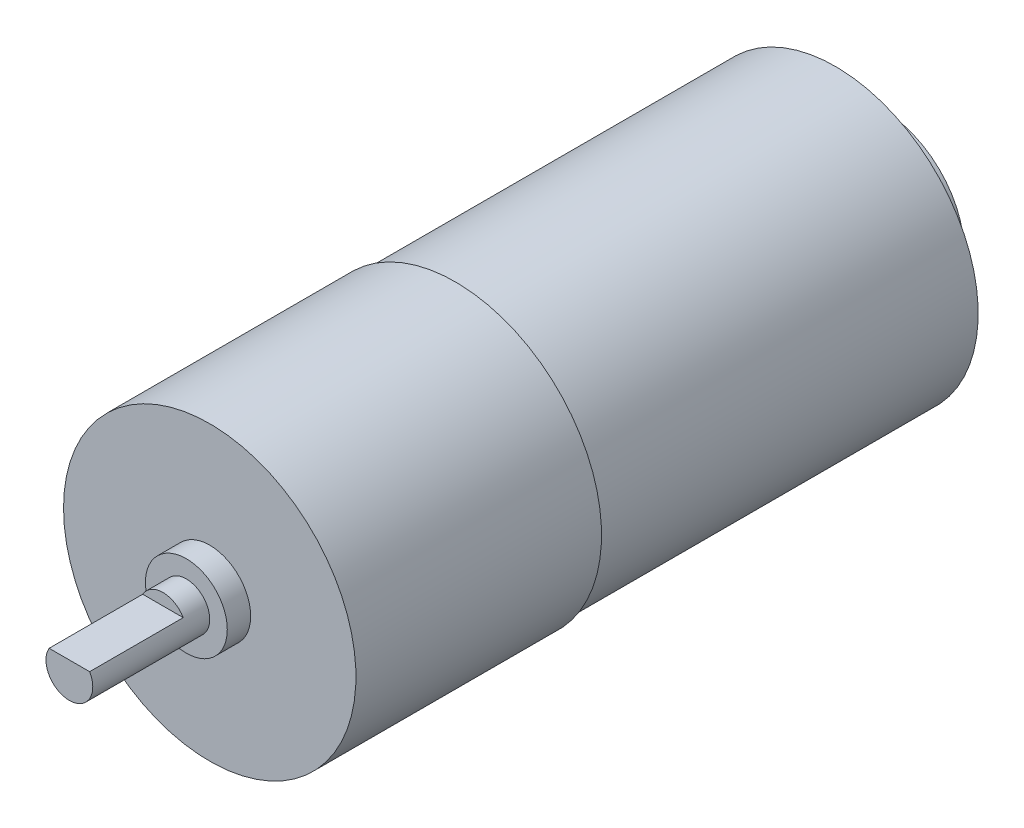
ISO-10303-21;
HEADER;
FILE_DESCRIPTION(('STEP AP214'),'2;1');
FILE_NAME('part.step','',(''),(''),'','','');
FILE_SCHEMA(('AUTOMOTIVE_DESIGN { 1 0 10303 214 1 1 1 1 }'));
ENDSEC;
DATA;
#1=APPLICATION_CONTEXT('core data for automotive mechanical design processes');
#2=APPLICATION_PROTOCOL_DEFINITION('international standard','automotive_design',2000,#1);
#3=PRODUCT_CONTEXT('',#1,'mechanical');
#4=PRODUCT('Part','Part','',(#3));
#5=PRODUCT_RELATED_PRODUCT_CATEGORY('part','',(#4));
#6=PRODUCT_DEFINITION_FORMATION('','',#4);
#7=PRODUCT_DEFINITION_CONTEXT('part definition',#1,'design');
#8=PRODUCT_DEFINITION('design','',#6,#7);
#9=PRODUCT_DEFINITION_SHAPE('','',#8);
#10=(LENGTH_UNIT() NAMED_UNIT(*) SI_UNIT(.MILLI.,.METRE.));
#11=(NAMED_UNIT(*) PLANE_ANGLE_UNIT() SI_UNIT($,.RADIAN.));
#12=(NAMED_UNIT(*) SI_UNIT($,.STERADIAN.) SOLID_ANGLE_UNIT());
#13=UNCERTAINTY_MEASURE_WITH_UNIT(LENGTH_MEASURE(1.E-05),#10,'distance_accuracy_value','');
#14=(GEOMETRIC_REPRESENTATION_CONTEXT(3) GLOBAL_UNCERTAINTY_ASSIGNED_CONTEXT((#13)) GLOBAL_UNIT_ASSIGNED_CONTEXT((#10,
#11,#12)) REPRESENTATION_CONTEXT('',''));
#15=CARTESIAN_POINT('',(0.,0.,0.));
#16=DIRECTION('',(0.,0.,1.));
#17=DIRECTION('',(1.,0.,0.));
#18=AXIS2_PLACEMENT_3D('',#15,#16,#17);
#19=CARTESIAN_POINT('',(0.,0.,33.));
#20=DIRECTION('',(0.,0.,-1.));
#21=DIRECTION('',(-1.,0.,0.));
#22=AXIS2_PLACEMENT_3D('',#19,#20,#21);
#23=CYLINDRICAL_SURFACE('',#22,2.);
#24=CARTESIAN_POINT('',(0.,0.,23.));
#25=DIRECTION('',(0.,0.,1.));
#26=DIRECTION('',(1.,0.,0.));
#27=AXIS2_PLACEMENT_3D('',#24,#25,#26);
#28=CIRCLE('',#27,2.);
#29=CARTESIAN_POINT('',(2.,0.,23.));
#30=VERTEX_POINT('',#29);
#31=EDGE_CURVE('E76',#30,#30,#28,.T.);
#32=ORIENTED_EDGE('',*,*,#31,.T.);
#33=EDGE_LOOP('',(#32));
#34=FACE_BOUND('',#33,.T.);
#35=DIRECTION('',(0.,0.,-1.));
#36=VECTOR('',#35,1.);
#37=CARTESIAN_POINT('',(1.73205080756888,1.,33.));
#38=LINE('',#37,#36);
#39=CARTESIAN_POINT('',(1.73205080756888,1.,33.));
#40=VERTEX_POINT('',#39);
#41=CARTESIAN_POINT('',(1.73205080756888,1.,25.));
#42=VERTEX_POINT('',#41);
#43=EDGE_CURVE('E71',#40,#42,#38,.T.);
#44=ORIENTED_EDGE('',*,*,#43,.F.);
#45=CARTESIAN_POINT('',(0.,0.,33.));
#46=DIRECTION('',(0.,0.,1.));
#47=DIRECTION('',(1.,0.,0.));
#48=AXIS2_PLACEMENT_3D('',#45,#46,#47);
#49=CIRCLE('',#48,2.);
#50=CARTESIAN_POINT('',(-1.73205080756888,1.,33.));
#51=VERTEX_POINT('',#50);
#52=EDGE_CURVE('E78',#51,#40,#49,.T.);
#53=ORIENTED_EDGE('',*,*,#52,.F.);
#54=DIRECTION('',(0.,0.,-1.));
#55=VECTOR('',#54,1.);
#56=CARTESIAN_POINT('',(-1.73205080756888,1.,33.));
#57=LINE('',#56,#55);
#58=CARTESIAN_POINT('',(-1.73205080756888,1.,25.));
#59=VERTEX_POINT('',#58);
#60=EDGE_CURVE('E59',#59,#51,#57,.F.);
#61=ORIENTED_EDGE('',*,*,#60,.F.);
#62=CARTESIAN_POINT('',(0.,0.,25.));
#63=DIRECTION('',(0.,0.,-1.));
#64=DIRECTION('',(-1.,0.,0.));
#65=AXIS2_PLACEMENT_3D('',#62,#63,#64);
#66=CIRCLE('',#65,2.);
#67=EDGE_CURVE('E11',#59,#42,#66,.T.);
#68=ORIENTED_EDGE('',*,*,#67,.T.);
#69=EDGE_LOOP('',(#44,#53,#61,#68));
#70=FACE_BOUND('',#69,.T.);
#71=ADVANCED_FACE('F43',(#34,#70),#23,.T.);
#72=CARTESIAN_POINT('',(0.,0.,33.));
#73=DIRECTION('',(0.,0.,1.));
#74=DIRECTION('',(1.,0.,0.));
#75=AXIS2_PLACEMENT_3D('',#72,#73,#74);
#76=PLANE('',#75);
#77=ORIENTED_EDGE('',*,*,#52,.T.);
#78=DIRECTION('',(-1.,0.,0.));
#79=VECTOR('',#78,1.);
#80=CARTESIAN_POINT('',(0.,1.,33.));
#81=LINE('',#80,#79);
#82=EDGE_CURVE('E52',#40,#51,#81,.T.);
#83=ORIENTED_EDGE('',*,*,#82,.T.);
#84=EDGE_LOOP('',(#77,#83));
#85=FACE_BOUND('',#84,.T.);
#86=ADVANCED_FACE('F81',(#85),#76,.T.);
#87=CARTESIAN_POINT('',(0.,0.,21.));
#88=DIRECTION('',(0.,0.,-1.));
#89=DIRECTION('',(-1.,0.,0.));
#90=AXIS2_PLACEMENT_3D('',#87,#88,#89);
#91=CYLINDRICAL_SURFACE('',#90,12.5);
#92=CARTESIAN_POINT('',(0.,0.,21.));
#93=DIRECTION('',(0.,0.,1.));
#94=DIRECTION('',(1.,0.,0.));
#95=AXIS2_PLACEMENT_3D('',#92,#93,#94);
#96=CIRCLE('',#95,12.5);
#97=CARTESIAN_POINT('',(-12.5,0.,21.));
#98=VERTEX_POINT('',#97);
#99=EDGE_CURVE('E102',#98,#98,#96,.T.);
#100=CARTESIAN_POINT('',(0.,0.,0.));
#101=DIRECTION('',(0.,0.,1.));
#102=DIRECTION('',(1.,0.,0.));
#103=AXIS2_PLACEMENT_3D('',#100,#101,#102);
#104=CIRCLE('',#103,12.5);
#105=CARTESIAN_POINT('',(-12.5,0.,0.));
#106=VERTEX_POINT('',#105);
#107=EDGE_CURVE('E87',#106,#106,#104,.T.);
#108=CARTESIAN_POINT('',(-12.5,0.,21.));
#109=CARTESIAN_POINT('',(-12.5,0.,20.78125));
#110=CARTESIAN_POINT('',(-12.5,0.,20.5625));
#111=CARTESIAN_POINT('',(-12.5,0.,20.125));
#112=CARTESIAN_POINT('',(-12.5,0.,19.90625));
#113=CARTESIAN_POINT('',(-12.5,0.,19.46875));
#114=CARTESIAN_POINT('',(-12.5,0.,19.25));
#115=CARTESIAN_POINT('',(-12.5,0.,18.8125));
#116=CARTESIAN_POINT('',(-12.5,0.,18.59375));
#117=CARTESIAN_POINT('',(-12.5,0.,18.15625));
#118=CARTESIAN_POINT('',(-12.5,0.,17.9375));
#119=CARTESIAN_POINT('',(-12.5,0.,17.5));
#120=CARTESIAN_POINT('',(-12.5,0.,17.28125));
#121=CARTESIAN_POINT('',(-12.5,0.,16.84375));
#122=CARTESIAN_POINT('',(-12.5,0.,16.625));
#123=CARTESIAN_POINT('',(-12.5,0.,16.1875));
#124=CARTESIAN_POINT('',(-12.5,0.,15.96875));
#125=CARTESIAN_POINT('',(-12.5,0.,15.53125));
#126=CARTESIAN_POINT('',(-12.5,0.,15.3125));
#127=CARTESIAN_POINT('',(-12.5,0.,14.875));
#128=CARTESIAN_POINT('',(-12.5,0.,14.65625));
#129=CARTESIAN_POINT('',(-12.5,0.,14.21875));
#130=CARTESIAN_POINT('',(-12.5,0.,14.));
#131=CARTESIAN_POINT('',(-12.5,0.,13.5625));
#132=CARTESIAN_POINT('',(-12.5,0.,13.34375));
#133=CARTESIAN_POINT('',(-12.5,0.,12.90625));
#134=CARTESIAN_POINT('',(-12.5,0.,12.6875));
#135=CARTESIAN_POINT('',(-12.5,0.,12.25));
#136=CARTESIAN_POINT('',(-12.5,0.,12.03125));
#137=CARTESIAN_POINT('',(-12.5,0.,11.59375));
#138=CARTESIAN_POINT('',(-12.5,0.,11.375));
#139=CARTESIAN_POINT('',(-12.5,0.,10.9375));
#140=CARTESIAN_POINT('',(-12.5,0.,10.71875));
#141=CARTESIAN_POINT('',(-12.5,0.,10.28125));
#142=CARTESIAN_POINT('',(-12.5,0.,10.0625));
#143=CARTESIAN_POINT('',(-12.5,0.,9.625));
#144=CARTESIAN_POINT('',(-12.5,0.,9.40625));
#145=CARTESIAN_POINT('',(-12.5,0.,8.96875));
#146=CARTESIAN_POINT('',(-12.5,0.,8.75));
#147=CARTESIAN_POINT('',(-12.5,0.,8.3125));
#148=CARTESIAN_POINT('',(-12.5,0.,8.09375));
#149=CARTESIAN_POINT('',(-12.5,0.,7.65625));
#150=CARTESIAN_POINT('',(-12.5,0.,7.4375));
#151=CARTESIAN_POINT('',(-12.5,0.,7.));
#152=CARTESIAN_POINT('',(-12.5,0.,6.78125));
#153=CARTESIAN_POINT('',(-12.5,0.,6.34375));
#154=CARTESIAN_POINT('',(-12.5,0.,6.125));
#155=CARTESIAN_POINT('',(-12.5,0.,5.6875));
#156=CARTESIAN_POINT('',(-12.5,0.,5.46875));
#157=CARTESIAN_POINT('',(-12.5,0.,5.03125));
#158=CARTESIAN_POINT('',(-12.5,0.,4.8125));
#159=CARTESIAN_POINT('',(-12.5,0.,4.375));
#160=CARTESIAN_POINT('',(-12.5,0.,4.15625));
#161=CARTESIAN_POINT('',(-12.5,0.,3.71875));
#162=CARTESIAN_POINT('',(-12.5,0.,3.5));
#163=CARTESIAN_POINT('',(-12.5,0.,3.0625));
#164=CARTESIAN_POINT('',(-12.5,0.,2.84375));
#165=CARTESIAN_POINT('',(-12.5,0.,2.40625));
#166=CARTESIAN_POINT('',(-12.5,0.,2.1875));
#167=CARTESIAN_POINT('',(-12.5,0.,1.75));
#168=CARTESIAN_POINT('',(-12.5,0.,1.53125));
#169=CARTESIAN_POINT('',(-12.5,0.,1.09375));
#170=CARTESIAN_POINT('',(-12.5,0.,0.875000000000001));
#171=CARTESIAN_POINT('',(-12.5,0.,0.4375));
#172=CARTESIAN_POINT('',(-12.5,0.,0.21875));
#173=CARTESIAN_POINT('',(-12.5,0.,0.));
#174=B_SPLINE_CURVE_WITH_KNOTS('',3,(#108,#109,#110,#111,#112,#113,#114,#115,#116,#117,#118,
#119,#120,#121,#122,#123,#124,#125,#126,#127,#128,#129,#130,#131,#132,#133,#134,#135,#136,#137,
#138,#139,#140,#141,#142,#143,#144,#145,#146,#147,#148,#149,#150,#151,#152,#153,#154,#155,#156,
#157,#158,#159,#160,#161,#162,#163,#164,#165,#166,#167,#168,#169,#170,#171,#172,#173),
.UNSPECIFIED.,.F.,.F.,(4,2,2,2,2,2,2,2,2,2,2,2,2,2,2,2,2,2,2,2,2,2,2,2,2,2,2,2,2,2,2,2,4),(0.,
0.656249999999997,1.3125,1.96875,2.625,3.28125,3.9375,4.59375,5.25,5.90625,6.5625,7.21875,7.875,
8.53125,9.1875,9.84375,10.5,11.15625,11.8125,12.46875,13.125,13.78125,14.4375,15.09375,15.75,
16.40625,17.0625,17.71875,18.375,19.03125,19.6875,20.34375,21.),.UNSPECIFIED.);
#175=EDGE_CURVE('BSEAM45',#98,#106,#174,.T.);
#176=ORIENTED_EDGE('',*,*,#99,.F.);
#177=ORIENTED_EDGE('',*,*,#107,.T.);
#178=ORIENTED_EDGE('',*,*,#175,.T.);
#179=ORIENTED_EDGE('',*,*,#175,.F.);
#180=EDGE_LOOP('',(#176,#178,#177,#179));
#181=FACE_BOUND('',#180,.T.);
#182=ADVANCED_FACE('F45',(#181),#91,.T.);
#183=CARTESIAN_POINT('',(0.,0.,21.));
#184=DIRECTION('',(0.,0.,1.));
#185=DIRECTION('',(1.,0.,0.));
#186=AXIS2_PLACEMENT_3D('',#183,#184,#185);
#187=PLANE('',#186);
#188=CARTESIAN_POINT('',(0.,0.,21.));
#189=DIRECTION('',(0.,0.,1.));
#190=DIRECTION('',(1.,0.,0.));
#191=AXIS2_PLACEMENT_3D('',#188,#189,#190);
#192=CIRCLE('',#191,3.5);
#193=CARTESIAN_POINT('',(3.5,0.,21.));
#194=VERTEX_POINT('',#193);
#195=EDGE_CURVE('E93',#194,#194,#192,.T.);
#196=ORIENTED_EDGE('',*,*,#195,.F.);
#197=EDGE_LOOP('',(#196));
#198=FACE_BOUND('',#197,.T.);
#199=ORIENTED_EDGE('',*,*,#99,.T.);
#200=EDGE_LOOP('',(#199));
#201=FACE_BOUND('',#200,.T.);
#202=ADVANCED_FACE('F114',(#198,#201),#187,.T.);
#203=CARTESIAN_POINT('',(0.,0.,0.));
#204=DIRECTION('',(0.,0.,1.));
#205=DIRECTION('',(1.,0.,0.));
#206=AXIS2_PLACEMENT_3D('',#203,#204,#205);
#207=PLANE('',#206);
#208=CARTESIAN_POINT('',(0.,0.,0.));
#209=DIRECTION('',(0.,0.,-1.));
#210=DIRECTION('',(-1.,0.,0.));
#211=AXIS2_PLACEMENT_3D('',#208,#209,#210);
#212=CIRCLE('',#211,12.2);
#213=CARTESIAN_POINT('',(-12.2,0.,0.));
#214=VERTEX_POINT('',#213);
#215=EDGE_CURVE('E98',#214,#214,#212,.T.);
#216=ORIENTED_EDGE('',*,*,#215,.F.);
#217=EDGE_LOOP('',(#216));
#218=FACE_BOUND('',#217,.T.);
#219=ORIENTED_EDGE('',*,*,#107,.F.);
#220=EDGE_LOOP('',(#219));
#221=FACE_BOUND('',#220,.T.);
#222=ADVANCED_FACE('F111',(#218,#221),#207,.F.);
#223=CARTESIAN_POINT('',(0.,0.,-31.));
#224=DIRECTION('',(0.,0.,1.));
#225=DIRECTION('',(1.,0.,0.));
#226=AXIS2_PLACEMENT_3D('',#223,#224,#225);
#227=CYLINDRICAL_SURFACE('',#226,12.2);
#228=ORIENTED_EDGE('',*,*,#215,.T.);
#229=EDGE_LOOP('',(#228));
#230=FACE_BOUND('',#229,.T.);
#231=CARTESIAN_POINT('',(0.,0.,-32.5));
#232=DIRECTION('',(0.,0.,-1.));
#233=DIRECTION('',(-1.,0.,0.));
#234=AXIS2_PLACEMENT_3D('',#231,#232,#233);
#235=CIRCLE('',#234,12.2);
#236=CARTESIAN_POINT('',(-12.2,0.,-32.5));
#237=VERTEX_POINT('',#236);
#238=EDGE_CURVE('E290',#237,#237,#235,.T.);
#239=ORIENTED_EDGE('',*,*,#238,.F.);
#240=EDGE_LOOP('',(#239));
#241=FACE_BOUND('',#240,.T.);
#242=ADVANCED_FACE('F113',(#230,#241),#227,.T.);
#243=CARTESIAN_POINT('',(0.,0.,23.));
#244=DIRECTION('',(0.,0.,-1.));
#245=DIRECTION('',(-1.,0.,0.));
#246=AXIS2_PLACEMENT_3D('',#243,#244,#245);
#247=CYLINDRICAL_SURFACE('',#246,3.5);
#248=CARTESIAN_POINT('',(0.,0.,23.));
#249=DIRECTION('',(0.,0.,1.));
#250=DIRECTION('',(1.,0.,0.));
#251=AXIS2_PLACEMENT_3D('',#248,#249,#250);
#252=CIRCLE('',#251,3.5);
#253=CARTESIAN_POINT('',(3.5,0.,23.));
#254=VERTEX_POINT('',#253);
#255=EDGE_CURVE('E83',#254,#254,#252,.T.);
#256=ORIENTED_EDGE('',*,*,#255,.F.);
#257=EDGE_LOOP('',(#256));
#258=FACE_BOUND('',#257,.T.);
#259=ORIENTED_EDGE('',*,*,#195,.T.);
#260=EDGE_LOOP('',(#259));
#261=FACE_BOUND('',#260,.T.);
#262=ADVANCED_FACE('F120',(#258,#261),#247,.T.);
#263=CARTESIAN_POINT('',(0.,0.,23.));
#264=DIRECTION('',(0.,0.,1.));
#265=DIRECTION('',(1.,0.,0.));
#266=AXIS2_PLACEMENT_3D('',#263,#264,#265);
#267=PLANE('',#266);
#268=ORIENTED_EDGE('',*,*,#31,.F.);
#269=EDGE_LOOP('',(#268));
#270=FACE_BOUND('',#269,.T.);
#271=ORIENTED_EDGE('',*,*,#255,.T.);
#272=EDGE_LOOP('',(#271));
#273=FACE_BOUND('',#272,.T.);
#274=ADVANCED_FACE('F135',(#270,#273),#267,.T.);
#275=CARTESIAN_POINT('',(0.,0.,25.));
#276=DIRECTION('',(0.,0.,-1.));
#277=DIRECTION('',(-1.,0.,0.));
#278=AXIS2_PLACEMENT_3D('',#275,#276,#277);
#279=PLANE('',#278);
#280=DIRECTION('',(-1.,0.,0.));
#281=VECTOR('',#280,1.);
#282=CARTESIAN_POINT('',(3.68996604631559,1.,25.));
#283=LINE('',#282,#281);
#284=EDGE_CURVE('E297',#42,#59,#283,.T.);
#285=ORIENTED_EDGE('',*,*,#284,.F.);
#286=ORIENTED_EDGE('',*,*,#67,.F.);
#287=EDGE_LOOP('',(#285,#286));
#288=FACE_BOUND('',#287,.T.);
#289=ADVANCED_FACE('F138',(#288),#279,.F.);
#290=CARTESIAN_POINT('',(3.68996604631559,1.,25.));
#291=DIRECTION('',(0.,1.,0.));
#292=DIRECTION('',(0.,0.,1.));
#293=AXIS2_PLACEMENT_3D('',#290,#291,#292);
#294=PLANE('',#293);
#295=ORIENTED_EDGE('',*,*,#43,.T.);
#296=ORIENTED_EDGE('',*,*,#284,.T.);
#297=ORIENTED_EDGE('',*,*,#60,.T.);
#298=ORIENTED_EDGE('',*,*,#82,.F.);
#299=EDGE_LOOP('',(#295,#296,#297,#298));
#300=FACE_BOUND('',#299,.T.);
#301=ADVANCED_FACE('F70',(#300),#294,.T.);
#302=CARTESIAN_POINT('',(0.,0.,-32.5));
#303=DIRECTION('',(0.,0.,-1.));
#304=DIRECTION('',(-1.,0.,0.));
#305=AXIS2_PLACEMENT_3D('',#302,#303,#304);
#306=PLANE('',#305);
#307=CARTESIAN_POINT('',(0.,0.,-32.5));
#308=DIRECTION('',(0.,0.,-1.));
#309=DIRECTION('',(-1.,0.,0.));
#310=AXIS2_PLACEMENT_3D('',#307,#308,#309);
#311=CIRCLE('',#310,0.75);
#312=CARTESIAN_POINT('',(-0.75,0.,-32.5));
#313=VERTEX_POINT('',#312);
#314=EDGE_CURVE('E285',#313,#313,#311,.T.);
#315=ORIENTED_EDGE('',*,*,#314,.F.);
#316=EDGE_LOOP('',(#315));
#317=FACE_BOUND('',#316,.T.);
#318=ORIENTED_EDGE('',*,*,#238,.T.);
#319=EDGE_LOOP('',(#318));
#320=FACE_BOUND('',#319,.T.);
#321=ADVANCED_FACE('F201',(#317,#320),#306,.T.);
#322=CARTESIAN_POINT('',(0.,0.,-33.5));
#323=DIRECTION('',(0.,0.,1.));
#324=DIRECTION('',(1.,0.,0.));
#325=AXIS2_PLACEMENT_3D('',#322,#323,#324);
#326=CYLINDRICAL_SURFACE('',#325,0.75);
#327=CARTESIAN_POINT('',(0.,0.,-33.5));
#328=DIRECTION('',(0.,0.,-1.));
#329=DIRECTION('',(-1.,0.,0.));
#330=AXIS2_PLACEMENT_3D('',#327,#328,#329);
#331=CIRCLE('',#330,0.75);
#332=CARTESIAN_POINT('',(-0.75,0.,-33.5));
#333=VERTEX_POINT('',#332);
#334=EDGE_CURVE('E275',#333,#333,#331,.T.);
#335=ORIENTED_EDGE('',*,*,#334,.F.);
#336=EDGE_LOOP('',(#335));
#337=FACE_BOUND('',#336,.T.);
#338=ORIENTED_EDGE('',*,*,#314,.T.);
#339=EDGE_LOOP('',(#338));
#340=FACE_BOUND('',#339,.T.);
#341=ADVANCED_FACE('F216',(#337,#340),#326,.T.);
#342=CARTESIAN_POINT('',(0.,0.,-36.5));
#343=DIRECTION('',(0.,0.,1.));
#344=DIRECTION('',(1.,0.,0.));
#345=AXIS2_PLACEMENT_3D('',#342,#343,#344);
#346=CYLINDRICAL_SURFACE('',#345,7.);
#347=CARTESIAN_POINT('',(0.,0.,-36.5));
#348=DIRECTION('',(0.,0.,-1.));
#349=DIRECTION('',(-1.,0.,0.));
#350=AXIS2_PLACEMENT_3D('',#347,#348,#349);
#351=CIRCLE('',#350,7.);
#352=CARTESIAN_POINT('',(-7.,0.,-36.5));
#353=VERTEX_POINT('',#352);
#354=EDGE_CURVE('E281',#353,#353,#351,.T.);
#355=ORIENTED_EDGE('',*,*,#354,.F.);
#356=EDGE_LOOP('',(#355));
#357=FACE_BOUND('',#356,.T.);
#358=CARTESIAN_POINT('',(0.,0.,-33.5));
#359=DIRECTION('',(0.,0.,-1.));
#360=DIRECTION('',(-1.,0.,0.));
#361=AXIS2_PLACEMENT_3D('',#358,#359,#360);
#362=CIRCLE('',#361,7.);
#363=CARTESIAN_POINT('',(-7.,0.,-33.5));
#364=VERTEX_POINT('',#363);
#365=EDGE_CURVE('E278',#364,#364,#362,.T.);
#366=ORIENTED_EDGE('',*,*,#365,.T.);
#367=EDGE_LOOP('',(#366));
#368=FACE_BOUND('',#367,.T.);
#369=ADVANCED_FACE('F227',(#357,#368),#346,.T.);
#370=CARTESIAN_POINT('',(0.,0.,-36.5));
#371=DIRECTION('',(0.,0.,-1.));
#372=DIRECTION('',(-1.,0.,0.));
#373=AXIS2_PLACEMENT_3D('',#370,#371,#372);
#374=PLANE('',#373);
#375=ORIENTED_EDGE('',*,*,#354,.T.);
#376=EDGE_LOOP('',(#375));
#377=FACE_BOUND('',#376,.T.);
#378=ADVANCED_FACE('F238',(#377),#374,.T.);
#379=CARTESIAN_POINT('',(0.,0.,-33.5));
#380=DIRECTION('',(0.,0.,-1.));
#381=DIRECTION('',(-1.,0.,0.));
#382=AXIS2_PLACEMENT_3D('',#379,#380,#381);
#383=PLANE('',#382);
#384=ORIENTED_EDGE('',*,*,#334,.T.);
#385=EDGE_LOOP('',(#384));
#386=FACE_BOUND('',#385,.T.);
#387=ORIENTED_EDGE('',*,*,#365,.F.);
#388=EDGE_LOOP('',(#387));
#389=FACE_BOUND('',#388,.T.);
#390=ADVANCED_FACE('F249',(#386,#389),#383,.F.);
#391=CLOSED_SHELL('',(#71,#86,#182,#202,#222,#242,#262,#274,#289,#301,#321,#341,#369,#378,#390));
#392=MANIFOLD_SOLID_BREP('B2',#391);
#393=ADVANCED_BREP_SHAPE_REPRESENTATION('',(#18,#392),#14);
#394=SHAPE_DEFINITION_REPRESENTATION(#9,#393);
ENDSEC;
END-ISO-10303-21;
